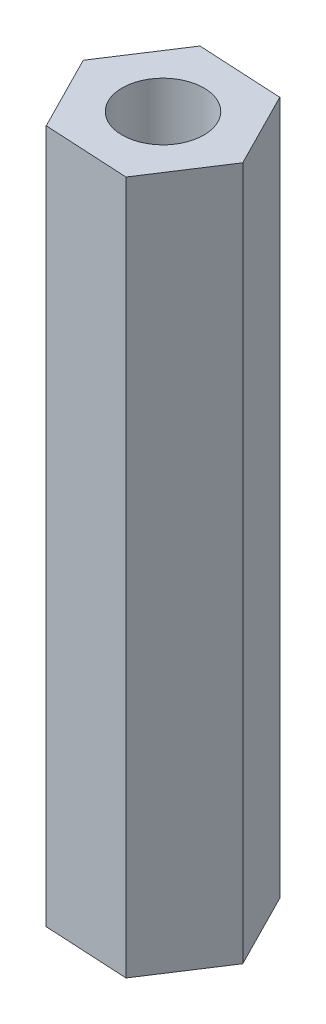
ISO-10303-21;
HEADER;
FILE_DESCRIPTION(('STEP AP214'),'2;1');
FILE_NAME('part.step','',(''),(''),'','','');
FILE_SCHEMA(('AUTOMOTIVE_DESIGN { 1 0 10303 214 1 1 1 1 }'));
ENDSEC;
DATA;
#1=APPLICATION_CONTEXT('core data for automotive mechanical design processes');
#2=APPLICATION_PROTOCOL_DEFINITION('international standard','automotive_design',2000,#1);
#3=PRODUCT_CONTEXT('',#1,'mechanical');
#4=PRODUCT('Part','Part','',(#3));
#5=PRODUCT_RELATED_PRODUCT_CATEGORY('part','',(#4));
#6=PRODUCT_DEFINITION_FORMATION('','',#4);
#7=PRODUCT_DEFINITION_CONTEXT('part definition',#1,'design');
#8=PRODUCT_DEFINITION('design','',#6,#7);
#9=PRODUCT_DEFINITION_SHAPE('','',#8);
#10=(LENGTH_UNIT() NAMED_UNIT(*) SI_UNIT(.MILLI.,.METRE.));
#11=(NAMED_UNIT(*) PLANE_ANGLE_UNIT() SI_UNIT($,.RADIAN.));
#12=(NAMED_UNIT(*) SI_UNIT($,.STERADIAN.) SOLID_ANGLE_UNIT());
#13=UNCERTAINTY_MEASURE_WITH_UNIT(LENGTH_MEASURE(1.E-05),#10,'distance_accuracy_value','');
#14=(GEOMETRIC_REPRESENTATION_CONTEXT(3) GLOBAL_UNCERTAINTY_ASSIGNED_CONTEXT((#13)) GLOBAL_UNIT_ASSIGNED_CONTEXT((#10,
#11,#12)) REPRESENTATION_CONTEXT('',''));
#15=CARTESIAN_POINT('',(0.,0.,0.));
#16=DIRECTION('',(0.,0.,1.));
#17=DIRECTION('',(1.,0.,0.));
#18=AXIS2_PLACEMENT_3D('',#15,#16,#17);
#19=CARTESIAN_POINT('',(1.54318664004275,28.,3.03675951094697));
#20=DIRECTION('',(-0.838083193513256,0.,-0.545542446332659));
#21=DIRECTION('',(-0.545542446332659,0.,0.838083193513256));
#22=AXIS2_PLACEMENT_3D('',#19,#20,#21);
#23=PLANE('',#22);
#24=DIRECTION('',(0.545542446332659,0.,-0.838083193513256));
#25=VECTOR('',#24,1.);
#26=CARTESIAN_POINT('',(1.54318664004275,0.,3.03675951094697));
#27=LINE('',#26,#25);
#28=CARTESIAN_POINT('',(1.54318664004275,0.,3.03675951094697));
#29=VERTEX_POINT('',#28);
#30=CARTESIAN_POINT('',(3.40150420168546,0.,0.181940922415713));
#31=VERTEX_POINT('',#30);
#32=EDGE_CURVE('E125',#29,#31,#27,.T.);
#33=ORIENTED_EDGE('',*,*,#32,.T.);
#34=DIRECTION('',(0.,-1.,0.));
#35=VECTOR('',#34,1.);
#36=CARTESIAN_POINT('',(3.40150420168546,28.,0.181940922415713));
#37=LINE('',#36,#35);
#38=CARTESIAN_POINT('',(3.40150420168546,28.,0.181940922415713));
#39=VERTEX_POINT('',#38);
#40=EDGE_CURVE('E11',#39,#31,#37,.T.);
#41=ORIENTED_EDGE('',*,*,#40,.F.);
#42=DIRECTION('',(0.545542446332659,0.,-0.838083193513256));
#43=VECTOR('',#42,1.);
#44=CARTESIAN_POINT('',(1.54318664004275,28.,3.03675951094697));
#45=LINE('',#44,#43);
#46=CARTESIAN_POINT('',(1.54318664004275,28.,3.03675951094697));
#47=VERTEX_POINT('',#46);
#48=EDGE_CURVE('E136',#47,#39,#45,.T.);
#49=ORIENTED_EDGE('',*,*,#48,.F.);
#50=DIRECTION('',(0.,-1.,0.));
#51=VECTOR('',#50,1.);
#52=CARTESIAN_POINT('',(1.54318664004275,28.,3.03675951094697));
#53=LINE('',#52,#51);
#54=EDGE_CURVE('E121',#47,#29,#53,.T.);
#55=ORIENTED_EDGE('',*,*,#54,.T.);
#56=EDGE_LOOP('',(#33,#41,#49,#55));
#57=FACE_BOUND('',#56,.T.);
#58=ADVANCED_FACE('F41',(#57),#23,.F.);
#59=CARTESIAN_POINT('',(3.40150420168546,28.,0.181940922415713));
#60=DIRECTION('',(-0.891495214123419,0.,0.45303011290094));
#61=DIRECTION('',(0.45303011290094,0.,0.891495214123419));
#62=AXIS2_PLACEMENT_3D('',#59,#60,#61);
#63=PLANE('',#62);
#64=DIRECTION('',(-0.45303011290094,0.,-0.891495214123419));
#65=VECTOR('',#64,1.);
#66=CARTESIAN_POINT('',(3.40150420168546,0.,0.181940922415713));
#67=LINE('',#66,#65);
#68=CARTESIAN_POINT('',(1.85831756164271,0.,-2.85481858853126));
#69=VERTEX_POINT('',#68);
#70=EDGE_CURVE('E126',#31,#69,#67,.T.);
#71=ORIENTED_EDGE('',*,*,#70,.T.);
#72=DIRECTION('',(0.,-1.,0.));
#73=VECTOR('',#72,1.);
#74=CARTESIAN_POINT('',(1.85831756164271,28.,-2.85481858853126));
#75=LINE('',#74,#73);
#76=CARTESIAN_POINT('',(1.85831756164271,28.,-2.85481858853126));
#77=VERTEX_POINT('',#76);
#78=EDGE_CURVE('E47',#77,#69,#75,.T.);
#79=ORIENTED_EDGE('',*,*,#78,.F.);
#80=DIRECTION('',(-0.45303011290094,0.,-0.891495214123419));
#81=VECTOR('',#80,1.);
#82=CARTESIAN_POINT('',(3.40150420168546,28.,0.181940922415713));
#83=LINE('',#82,#81);
#84=EDGE_CURVE('E94',#39,#77,#83,.T.);
#85=ORIENTED_EDGE('',*,*,#84,.F.);
#86=ORIENTED_EDGE('',*,*,#40,.T.);
#87=EDGE_LOOP('',(#71,#79,#85,#86));
#88=FACE_BOUND('',#87,.T.);
#89=ADVANCED_FACE('F161',(#88),#63,.F.);
#90=CARTESIAN_POINT('',(1.85831756164271,28.,-2.85481858853126));
#91=DIRECTION('',(-0.0534120206101634,0.,0.998572559233599));
#92=DIRECTION('',(0.998572559233599,0.,0.0534120206101634));
#93=AXIS2_PLACEMENT_3D('',#90,#91,#92);
#94=PLANE('',#93);
#95=DIRECTION('',(-0.998572559233599,0.,-0.0534120206101634));
#96=VECTOR('',#95,1.);
#97=CARTESIAN_POINT('',(1.85831756164271,0.,-2.85481858853126));
#98=LINE('',#97,#96);
#99=CARTESIAN_POINT('',(-1.54318664004275,0.,-3.03675951094697));
#100=VERTEX_POINT('',#99);
#101=EDGE_CURVE('E133',#69,#100,#98,.T.);
#102=ORIENTED_EDGE('',*,*,#101,.T.);
#103=DIRECTION('',(0.,-1.,0.));
#104=VECTOR('',#103,1.);
#105=CARTESIAN_POINT('',(-1.54318664004275,28.,-3.03675951094697));
#106=LINE('',#105,#104);
#107=CARTESIAN_POINT('',(-1.54318664004275,28.,-3.03675951094697));
#108=VERTEX_POINT('',#107);
#109=EDGE_CURVE('E118',#108,#100,#106,.T.);
#110=ORIENTED_EDGE('',*,*,#109,.F.);
#111=DIRECTION('',(-0.998572559233599,0.,-0.0534120206101634));
#112=VECTOR('',#111,1.);
#113=CARTESIAN_POINT('',(1.85831756164271,28.,-2.85481858853126));
#114=LINE('',#113,#112);
#115=EDGE_CURVE('E110',#77,#108,#114,.T.);
#116=ORIENTED_EDGE('',*,*,#115,.F.);
#117=ORIENTED_EDGE('',*,*,#78,.T.);
#118=EDGE_LOOP('',(#102,#110,#116,#117));
#119=FACE_BOUND('',#118,.T.);
#120=ADVANCED_FACE('F142',(#119),#94,.F.);
#121=CARTESIAN_POINT('',(-1.54318664004275,28.,-3.03675951094697));
#122=DIRECTION('',(0.838083193513256,0.,0.545542446332659));
#123=DIRECTION('',(0.545542446332659,0.,-0.838083193513256));
#124=AXIS2_PLACEMENT_3D('',#121,#122,#123);
#125=PLANE('',#124);
#126=DIRECTION('',(-0.545542446332659,0.,0.838083193513256));
#127=VECTOR('',#126,1.);
#128=CARTESIAN_POINT('',(-1.54318664004275,0.,-3.03675951094697));
#129=LINE('',#128,#127);
#130=CARTESIAN_POINT('',(-3.40150420168546,0.,-0.181940922415714));
#131=VERTEX_POINT('',#130);
#132=EDGE_CURVE('E113',#100,#131,#129,.T.);
#133=ORIENTED_EDGE('',*,*,#132,.T.);
#134=DIRECTION('',(0.,-1.,0.));
#135=VECTOR('',#134,1.);
#136=CARTESIAN_POINT('',(-3.40150420168546,28.,-0.181940922415714));
#137=LINE('',#136,#135);
#138=CARTESIAN_POINT('',(-3.40150420168546,28.,-0.181940922415714));
#139=VERTEX_POINT('',#138);
#140=EDGE_CURVE('E115',#139,#131,#137,.T.);
#141=ORIENTED_EDGE('',*,*,#140,.F.);
#142=DIRECTION('',(-0.545542446332659,0.,0.838083193513256));
#143=VECTOR('',#142,1.);
#144=CARTESIAN_POINT('',(-1.54318664004275,28.,-3.03675951094697));
#145=LINE('',#144,#143);
#146=EDGE_CURVE('E101',#108,#139,#145,.T.);
#147=ORIENTED_EDGE('',*,*,#146,.F.);
#148=ORIENTED_EDGE('',*,*,#109,.T.);
#149=EDGE_LOOP('',(#133,#141,#147,#148));
#150=FACE_BOUND('',#149,.T.);
#151=ADVANCED_FACE('F114',(#150),#125,.F.);
#152=CARTESIAN_POINT('',(-3.40150420168546,28.,-0.181940922415714));
#153=DIRECTION('',(0.891495214123419,0.,-0.45303011290094));
#154=DIRECTION('',(-0.45303011290094,0.,-0.89149521412342));
#155=AXIS2_PLACEMENT_3D('',#152,#153,#154);
#156=PLANE('',#155);
#157=DIRECTION('',(0.45303011290094,0.,0.891495214123419));
#158=VECTOR('',#157,1.);
#159=CARTESIAN_POINT('',(-3.40150420168546,0.,-0.181940922415714));
#160=LINE('',#159,#158);
#161=CARTESIAN_POINT('',(-1.85831756164271,0.,2.85481858853126));
#162=VERTEX_POINT('',#161);
#163=EDGE_CURVE('E76',#131,#162,#160,.T.);
#164=ORIENTED_EDGE('',*,*,#163,.T.);
#165=DIRECTION('',(0.,-1.,0.));
#166=VECTOR('',#165,1.);
#167=CARTESIAN_POINT('',(-1.85831756164271,28.,2.85481858853126));
#168=LINE('',#167,#166);
#169=CARTESIAN_POINT('',(-1.85831756164271,28.,2.85481858853126));
#170=VERTEX_POINT('',#169);
#171=EDGE_CURVE('E119',#170,#162,#168,.T.);
#172=ORIENTED_EDGE('',*,*,#171,.F.);
#173=DIRECTION('',(0.45303011290094,0.,0.891495214123419));
#174=VECTOR('',#173,1.);
#175=CARTESIAN_POINT('',(-3.40150420168546,28.,-0.181940922415714));
#176=LINE('',#175,#174);
#177=EDGE_CURVE('E104',#139,#170,#176,.T.);
#178=ORIENTED_EDGE('',*,*,#177,.F.);
#179=ORIENTED_EDGE('',*,*,#140,.T.);
#180=EDGE_LOOP('',(#164,#172,#178,#179));
#181=FACE_BOUND('',#180,.T.);
#182=ADVANCED_FACE('F120',(#181),#156,.F.);
#183=CARTESIAN_POINT('',(-1.85831756164271,28.,2.85481858853126));
#184=DIRECTION('',(0.0534120206101633,0.,-0.998572559233599));
#185=DIRECTION('',(-0.998572559233599,0.,-0.0534120206101634));
#186=AXIS2_PLACEMENT_3D('',#183,#184,#185);
#187=PLANE('',#186);
#188=DIRECTION('',(0.998572559233599,0.,0.0534120206101633));
#189=VECTOR('',#188,1.);
#190=CARTESIAN_POINT('',(-1.85831756164271,0.,2.85481858853126));
#191=LINE('',#190,#189);
#192=EDGE_CURVE('E88',#162,#29,#191,.T.);
#193=ORIENTED_EDGE('',*,*,#192,.T.);
#194=ORIENTED_EDGE('',*,*,#54,.F.);
#195=DIRECTION('',(0.998572559233599,0.,0.0534120206101633));
#196=VECTOR('',#195,1.);
#197=CARTESIAN_POINT('',(-1.85831756164271,28.,2.85481858853126));
#198=LINE('',#197,#196);
#199=EDGE_CURVE('E60',#170,#47,#198,.T.);
#200=ORIENTED_EDGE('',*,*,#199,.F.);
#201=ORIENTED_EDGE('',*,*,#171,.T.);
#202=EDGE_LOOP('',(#193,#194,#200,#201));
#203=FACE_BOUND('',#202,.T.);
#204=ADVANCED_FACE('F149',(#203),#187,.F.);
#205=CARTESIAN_POINT('',(0.,28.,0.));
#206=DIRECTION('',(0.,1.,0.));
#207=DIRECTION('',(0.,0.,1.));
#208=AXIS2_PLACEMENT_3D('',#205,#206,#207);
#209=PLANE('',#208);
#210=CARTESIAN_POINT('',(0.,28.,0.));
#211=DIRECTION('',(0.,1.,0.));
#212=DIRECTION('',(0.,0.,1.));
#213=AXIS2_PLACEMENT_3D('',#210,#211,#212);
#214=CIRCLE('',#213,1.64999999999999);
#215=CARTESIAN_POINT('',(0.,28.,1.64999999999999));
#216=VERTEX_POINT('',#215);
#217=EDGE_CURVE('E218',#216,#216,#214,.T.);
#218=ORIENTED_EDGE('',*,*,#217,.F.);
#219=EDGE_LOOP('',(#218));
#220=FACE_BOUND('',#219,.T.);
#221=ORIENTED_EDGE('',*,*,#48,.T.);
#222=ORIENTED_EDGE('',*,*,#84,.T.);
#223=ORIENTED_EDGE('',*,*,#115,.T.);
#224=ORIENTED_EDGE('',*,*,#146,.T.);
#225=ORIENTED_EDGE('',*,*,#177,.T.);
#226=ORIENTED_EDGE('',*,*,#199,.T.);
#227=EDGE_LOOP('',(#221,#222,#223,#224,#225,#226));
#228=FACE_BOUND('',#227,.T.);
#229=ADVANCED_FACE('F103',(#220,#228),#209,.T.);
#230=CARTESIAN_POINT('',(0.,0.,0.));
#231=DIRECTION('',(0.,1.,0.));
#232=DIRECTION('',(0.,0.,1.));
#233=AXIS2_PLACEMENT_3D('',#230,#231,#232);
#234=PLANE('',#233);
#235=CARTESIAN_POINT('',(0.,0.,0.));
#236=DIRECTION('',(0.,1.,0.));
#237=DIRECTION('',(0.,0.,1.));
#238=AXIS2_PLACEMENT_3D('',#235,#236,#237);
#239=CIRCLE('',#238,1.64999999999999);
#240=CARTESIAN_POINT('',(0.,0.,1.64999999999999));
#241=VERTEX_POINT('',#240);
#242=EDGE_CURVE('E129',#241,#241,#239,.T.);
#243=ORIENTED_EDGE('',*,*,#242,.T.);
#244=EDGE_LOOP('',(#243));
#245=FACE_BOUND('',#244,.T.);
#246=ORIENTED_EDGE('',*,*,#32,.F.);
#247=ORIENTED_EDGE('',*,*,#192,.F.);
#248=ORIENTED_EDGE('',*,*,#163,.F.);
#249=ORIENTED_EDGE('',*,*,#132,.F.);
#250=ORIENTED_EDGE('',*,*,#101,.F.);
#251=ORIENTED_EDGE('',*,*,#70,.F.);
#252=EDGE_LOOP('',(#246,#247,#248,#249,#250,#251));
#253=FACE_BOUND('',#252,.T.);
#254=ADVANCED_FACE('F144',(#245,#253),#234,.F.);
#255=CARTESIAN_POINT('',(0.,28.,0.));
#256=DIRECTION('',(0.,1.,0.));
#257=DIRECTION('',(0.,0.,1.));
#258=AXIS2_PLACEMENT_3D('',#255,#256,#257);
#259=CYLINDRICAL_SURFACE('',#258,1.64999999999999);
#260=ORIENTED_EDGE('',*,*,#242,.F.);
#261=EDGE_LOOP('',(#260));
#262=FACE_BOUND('',#261,.T.);
#263=ORIENTED_EDGE('',*,*,#217,.T.);
#264=EDGE_LOOP('',(#263));
#265=FACE_BOUND('',#264,.T.);
#266=ADVANCED_FACE('F199',(#262,#265),#259,.F.);
#267=CLOSED_SHELL('',(#58,#89,#120,#151,#182,#204,#229,#254,#266));
#268=MANIFOLD_SOLID_BREP('B2',#267);
#269=ADVANCED_BREP_SHAPE_REPRESENTATION('',(#18,#268),#14);
#270=SHAPE_DEFINITION_REPRESENTATION(#9,#269);
ENDSEC;
END-ISO-10303-21;
